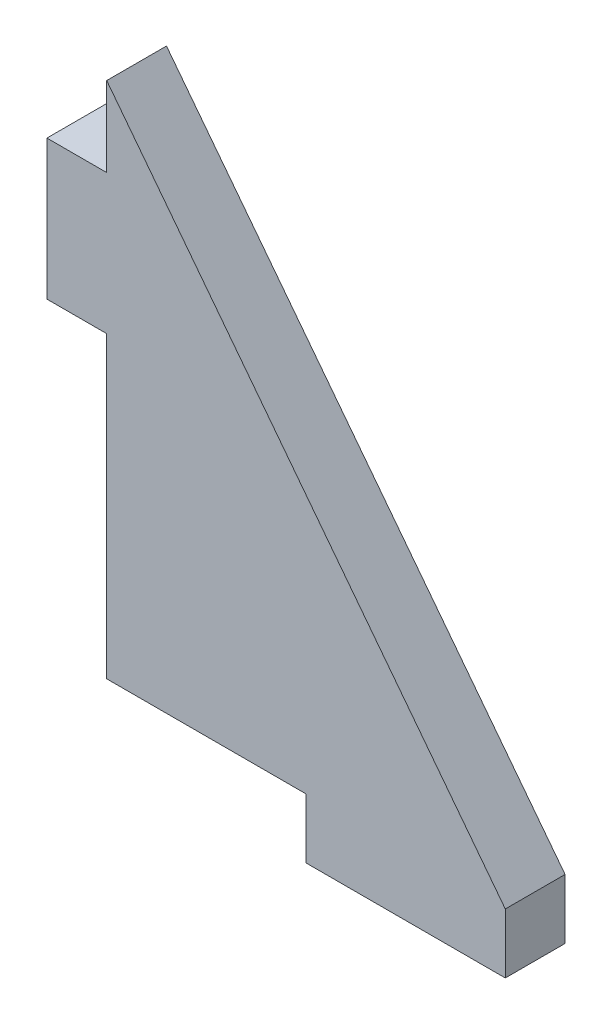
ISO-10303-21;
HEADER;
FILE_DESCRIPTION(('STEP AP214'),'2;1');
FILE_NAME('part.step','',(''),(''),'','','');
FILE_SCHEMA(('AUTOMOTIVE_DESIGN { 1 0 10303 214 1 1 1 1 }'));
ENDSEC;
DATA;
#1=APPLICATION_CONTEXT('core data for automotive mechanical design processes');
#2=APPLICATION_PROTOCOL_DEFINITION('international standard','automotive_design',2000,#1);
#3=PRODUCT_CONTEXT('',#1,'mechanical');
#4=PRODUCT('Part','Part','',(#3));
#5=PRODUCT_RELATED_PRODUCT_CATEGORY('part','',(#4));
#6=PRODUCT_DEFINITION_FORMATION('','',#4);
#7=PRODUCT_DEFINITION_CONTEXT('part definition',#1,'design');
#8=PRODUCT_DEFINITION('design','',#6,#7);
#9=PRODUCT_DEFINITION_SHAPE('','',#8);
#10=(LENGTH_UNIT() NAMED_UNIT(*) SI_UNIT(.MILLI.,.METRE.));
#11=(NAMED_UNIT(*) PLANE_ANGLE_UNIT() SI_UNIT($,.RADIAN.));
#12=(NAMED_UNIT(*) SI_UNIT($,.STERADIAN.) SOLID_ANGLE_UNIT());
#13=UNCERTAINTY_MEASURE_WITH_UNIT(LENGTH_MEASURE(1.E-05),#10,'distance_accuracy_value','');
#14=(GEOMETRIC_REPRESENTATION_CONTEXT(3) GLOBAL_UNCERTAINTY_ASSIGNED_CONTEXT((#13)) GLOBAL_UNIT_ASSIGNED_CONTEXT((#10,
#11,#12)) REPRESENTATION_CONTEXT('',''));
#15=CARTESIAN_POINT('',(0.,0.,0.));
#16=DIRECTION('',(0.,0.,1.));
#17=DIRECTION('',(1.,0.,0.));
#18=AXIS2_PLACEMENT_3D('',#15,#16,#17);
#19=CARTESIAN_POINT('',(0.,0.,3.));
#20=DIRECTION('',(0.,-1.,0.));
#21=DIRECTION('',(0.,0.,-1.));
#22=AXIS2_PLACEMENT_3D('',#19,#20,#21);
#23=PLANE('',#22);
#24=DIRECTION('',(-1.,0.,0.));
#25=VECTOR('',#24,1.);
#26=CARTESIAN_POINT('',(0.,0.,0.));
#27=LINE('',#26,#25);
#28=CARTESIAN_POINT('',(10.,0.,0.));
#29=VERTEX_POINT('',#28);
#30=CARTESIAN_POINT('',(0.,0.,0.));
#31=VERTEX_POINT('',#30);
#32=EDGE_CURVE('E144',#29,#31,#27,.T.);
#33=ORIENTED_EDGE('',*,*,#32,.F.);
#34=DIRECTION('',(0.,0.,-1.));
#35=VECTOR('',#34,1.);
#36=CARTESIAN_POINT('',(10.,0.,3.));
#37=LINE('',#36,#35);
#38=CARTESIAN_POINT('',(10.,0.,3.));
#39=VERTEX_POINT('',#38);
#40=EDGE_CURVE('E11',#39,#29,#37,.T.);
#41=ORIENTED_EDGE('',*,*,#40,.F.);
#42=DIRECTION('',(-1.,0.,0.));
#43=VECTOR('',#42,1.);
#44=CARTESIAN_POINT('',(0.,0.,3.));
#45=LINE('',#44,#43);
#46=CARTESIAN_POINT('',(0.,0.,3.));
#47=VERTEX_POINT('',#46);
#48=EDGE_CURVE('E202',#39,#47,#45,.T.);
#49=ORIENTED_EDGE('',*,*,#48,.T.);
#50=DIRECTION('',(0.,0.,-1.));
#51=VECTOR('',#50,1.);
#52=CARTESIAN_POINT('',(0.,0.,3.));
#53=LINE('',#52,#51);
#54=EDGE_CURVE('E52',#47,#31,#53,.T.);
#55=ORIENTED_EDGE('',*,*,#54,.T.);
#56=EDGE_LOOP('',(#33,#41,#49,#55));
#57=FACE_BOUND('',#56,.T.);
#58=ADVANCED_FACE('F36',(#57),#23,.T.);
#59=CARTESIAN_POINT('',(10.,0.,3.));
#60=DIRECTION('',(1.,0.,0.));
#61=DIRECTION('',(0.,0.,-1.));
#62=AXIS2_PLACEMENT_3D('',#59,#60,#61);
#63=PLANE('',#62);
#64=DIRECTION('',(0.,-1.,0.));
#65=VECTOR('',#64,1.);
#66=CARTESIAN_POINT('',(10.,0.,0.));
#67=LINE('',#66,#65);
#68=CARTESIAN_POINT('',(10.,-3.,0.));
#69=VERTEX_POINT('',#68);
#70=EDGE_CURVE('E146',#29,#69,#67,.T.);
#71=ORIENTED_EDGE('',*,*,#70,.T.);
#72=DIRECTION('',(0.,0.,-1.));
#73=VECTOR('',#72,1.);
#74=CARTESIAN_POINT('',(10.,-3.,3.));
#75=LINE('',#74,#73);
#76=CARTESIAN_POINT('',(10.,-3.,3.));
#77=VERTEX_POINT('',#76);
#78=EDGE_CURVE('E44',#77,#69,#75,.T.);
#79=ORIENTED_EDGE('',*,*,#78,.F.);
#80=DIRECTION('',(0.,-1.,0.));
#81=VECTOR('',#80,1.);
#82=CARTESIAN_POINT('',(10.,0.,3.));
#83=LINE('',#82,#81);
#84=EDGE_CURVE('E198',#39,#77,#83,.T.);
#85=ORIENTED_EDGE('',*,*,#84,.F.);
#86=ORIENTED_EDGE('',*,*,#40,.T.);
#87=EDGE_LOOP('',(#71,#79,#85,#86));
#88=FACE_BOUND('',#87,.T.);
#89=ADVANCED_FACE('F186',(#88),#63,.F.);
#90=CARTESIAN_POINT('',(0.,-3.,3.));
#91=DIRECTION('',(0.,-1.,0.));
#92=DIRECTION('',(1.,0.,0.));
#93=AXIS2_PLACEMENT_3D('',#90,#91,#92);
#94=PLANE('',#93);
#95=DIRECTION('',(-1.,0.,0.));
#96=VECTOR('',#95,1.);
#97=CARTESIAN_POINT('',(0.,-3.,0.));
#98=LINE('',#97,#96);
#99=CARTESIAN_POINT('',(20.,-3.,0.));
#100=VERTEX_POINT('',#99);
#101=EDGE_CURVE('E149',#100,#69,#98,.T.);
#102=ORIENTED_EDGE('',*,*,#101,.F.);
#103=DIRECTION('',(0.,0.,-1.));
#104=VECTOR('',#103,1.);
#105=CARTESIAN_POINT('',(20.,-3.,3.));
#106=LINE('',#105,#104);
#107=CARTESIAN_POINT('',(20.,-3.,3.));
#108=VERTEX_POINT('',#107);
#109=EDGE_CURVE('E176',#108,#100,#106,.T.);
#110=ORIENTED_EDGE('',*,*,#109,.F.);
#111=DIRECTION('',(-1.,0.,0.));
#112=VECTOR('',#111,1.);
#113=CARTESIAN_POINT('',(0.,-3.,3.));
#114=LINE('',#113,#112);
#115=EDGE_CURVE('E183',#108,#77,#114,.T.);
#116=ORIENTED_EDGE('',*,*,#115,.T.);
#117=ORIENTED_EDGE('',*,*,#78,.T.);
#118=EDGE_LOOP('',(#102,#110,#116,#117));
#119=FACE_BOUND('',#118,.T.);
#120=ADVANCED_FACE('F181',(#119),#94,.T.);
#121=CARTESIAN_POINT('',(20.,0.,3.));
#122=DIRECTION('',(1.,0.,0.));
#123=DIRECTION('',(0.,0.,-1.));
#124=AXIS2_PLACEMENT_3D('',#121,#122,#123);
#125=PLANE('',#124);
#126=DIRECTION('',(0.,-1.,0.));
#127=VECTOR('',#126,1.);
#128=CARTESIAN_POINT('',(20.,0.,0.));
#129=LINE('',#128,#127);
#130=CARTESIAN_POINT('',(20.,0.,0.));
#131=VERTEX_POINT('',#130);
#132=EDGE_CURVE('E152',#131,#100,#129,.T.);
#133=ORIENTED_EDGE('',*,*,#132,.F.);
#134=DIRECTION('',(0.,0.,-1.));
#135=VECTOR('',#134,1.);
#136=CARTESIAN_POINT('',(20.,0.,3.));
#137=LINE('',#136,#135);
#138=CARTESIAN_POINT('',(20.,0.,3.));
#139=VERTEX_POINT('',#138);
#140=EDGE_CURVE('E174',#139,#131,#137,.T.);
#141=ORIENTED_EDGE('',*,*,#140,.F.);
#142=DIRECTION('',(0.,-1.,0.));
#143=VECTOR('',#142,1.);
#144=CARTESIAN_POINT('',(20.,0.,3.));
#145=LINE('',#144,#143);
#146=EDGE_CURVE('E195',#139,#108,#145,.T.);
#147=ORIENTED_EDGE('',*,*,#146,.T.);
#148=ORIENTED_EDGE('',*,*,#109,.T.);
#149=EDGE_LOOP('',(#133,#141,#147,#148));
#150=FACE_BOUND('',#149,.T.);
#151=ADVANCED_FACE('F192',(#150),#125,.T.);
#152=CARTESIAN_POINT('',(12.5650557620818,9.66542750929368,3.));
#153=DIRECTION('',(0.7926239891046,0.609710760849692,0.));
#154=DIRECTION('',(-0.609710760849692,0.7926239891046,0.));
#155=AXIS2_PLACEMENT_3D('',#152,#153,#154);
#156=PLANE('',#155);
#157=DIRECTION('',(0.609710760849692,-0.7926239891046,0.));
#158=VECTOR('',#157,1.);
#159=CARTESIAN_POINT('',(12.5650557620818,9.66542750929368,0.));
#160=LINE('',#159,#158);
#161=CARTESIAN_POINT('',(0.,26.,0.));
#162=VERTEX_POINT('',#161);
#163=EDGE_CURVE('E155',#162,#131,#160,.T.);
#164=ORIENTED_EDGE('',*,*,#163,.F.);
#165=DIRECTION('',(0.,0.,-1.));
#166=VECTOR('',#165,1.);
#167=CARTESIAN_POINT('',(0.,26.,3.));
#168=LINE('',#167,#166);
#169=CARTESIAN_POINT('',(0.,26.,3.));
#170=VERTEX_POINT('',#169);
#171=EDGE_CURVE('E172',#170,#162,#168,.T.);
#172=ORIENTED_EDGE('',*,*,#171,.F.);
#173=DIRECTION('',(0.609710760849692,-0.7926239891046,0.));
#174=VECTOR('',#173,1.);
#175=CARTESIAN_POINT('',(12.5650557620818,9.66542750929368,3.));
#176=LINE('',#175,#174);
#177=EDGE_CURVE('E200',#170,#139,#176,.T.);
#178=ORIENTED_EDGE('',*,*,#177,.T.);
#179=ORIENTED_EDGE('',*,*,#140,.T.);
#180=EDGE_LOOP('',(#164,#172,#178,#179));
#181=FACE_BOUND('',#180,.T.);
#182=ADVANCED_FACE('F211',(#181),#156,.T.);
#183=CARTESIAN_POINT('',(0.,0.,3.));
#184=DIRECTION('',(-1.,0.,0.));
#185=DIRECTION('',(0.,0.,1.));
#186=AXIS2_PLACEMENT_3D('',#183,#184,#185);
#187=PLANE('',#186);
#188=DIRECTION('',(0.,1.,0.));
#189=VECTOR('',#188,1.);
#190=CARTESIAN_POINT('',(0.,0.,0.));
#191=LINE('',#190,#189);
#192=CARTESIAN_POINT('',(0.,22.,0.));
#193=VERTEX_POINT('',#192);
#194=EDGE_CURVE('E158',#193,#162,#191,.T.);
#195=ORIENTED_EDGE('',*,*,#194,.F.);
#196=DIRECTION('',(0.,0.,-1.));
#197=VECTOR('',#196,1.);
#198=CARTESIAN_POINT('',(0.,22.,3.));
#199=LINE('',#198,#197);
#200=CARTESIAN_POINT('',(0.,22.,3.));
#201=VERTEX_POINT('',#200);
#202=EDGE_CURVE('E170',#201,#193,#199,.T.);
#203=ORIENTED_EDGE('',*,*,#202,.F.);
#204=DIRECTION('',(0.,1.,0.));
#205=VECTOR('',#204,1.);
#206=CARTESIAN_POINT('',(0.,0.,3.));
#207=LINE('',#206,#205);
#208=EDGE_CURVE('E141',#201,#170,#207,.T.);
#209=ORIENTED_EDGE('',*,*,#208,.T.);
#210=ORIENTED_EDGE('',*,*,#171,.T.);
#211=EDGE_LOOP('',(#195,#203,#209,#210));
#212=FACE_BOUND('',#211,.T.);
#213=ADVANCED_FACE('F209',(#212),#187,.T.);
#214=CARTESIAN_POINT('',(0.,22.,3.));
#215=DIRECTION('',(0.,-1.,0.));
#216=DIRECTION('',(0.,0.,-1.));
#217=AXIS2_PLACEMENT_3D('',#214,#215,#216);
#218=PLANE('',#217);
#219=DIRECTION('',(-1.,0.,0.));
#220=VECTOR('',#219,1.);
#221=CARTESIAN_POINT('',(0.,22.,0.));
#222=LINE('',#221,#220);
#223=CARTESIAN_POINT('',(-3.,22.,0.));
#224=VERTEX_POINT('',#223);
#225=EDGE_CURVE('E161',#193,#224,#222,.T.);
#226=ORIENTED_EDGE('',*,*,#225,.T.);
#227=DIRECTION('',(0.,0.,-1.));
#228=VECTOR('',#227,1.);
#229=CARTESIAN_POINT('',(-3.,22.,3.));
#230=LINE('',#229,#228);
#231=CARTESIAN_POINT('',(-3.,22.,3.));
#232=VERTEX_POINT('',#231);
#233=EDGE_CURVE('E135',#232,#224,#230,.T.);
#234=ORIENTED_EDGE('',*,*,#233,.F.);
#235=DIRECTION('',(-1.,0.,0.));
#236=VECTOR('',#235,1.);
#237=CARTESIAN_POINT('',(0.,22.,3.));
#238=LINE('',#237,#236);
#239=EDGE_CURVE('E123',#201,#232,#238,.T.);
#240=ORIENTED_EDGE('',*,*,#239,.F.);
#241=ORIENTED_EDGE('',*,*,#202,.T.);
#242=EDGE_LOOP('',(#226,#234,#240,#241));
#243=FACE_BOUND('',#242,.T.);
#244=ADVANCED_FACE('F214',(#243),#218,.F.);
#245=CARTESIAN_POINT('',(-3.,0.,3.));
#246=DIRECTION('',(1.,0.,0.));
#247=DIRECTION('',(0.,1.,0.));
#248=AXIS2_PLACEMENT_3D('',#245,#246,#247);
#249=PLANE('',#248);
#250=DIRECTION('',(0.,-1.,0.));
#251=VECTOR('',#250,1.);
#252=CARTESIAN_POINT('',(-3.,0.,0.));
#253=LINE('',#252,#251);
#254=CARTESIAN_POINT('',(-3.,15.,0.));
#255=VERTEX_POINT('',#254);
#256=EDGE_CURVE('E132',#224,#255,#253,.T.);
#257=ORIENTED_EDGE('',*,*,#256,.T.);
#258=DIRECTION('',(0.,0.,-1.));
#259=VECTOR('',#258,1.);
#260=CARTESIAN_POINT('',(-3.,15.,3.));
#261=LINE('',#260,#259);
#262=CARTESIAN_POINT('',(-3.,15.,3.));
#263=VERTEX_POINT('',#262);
#264=EDGE_CURVE('E129',#263,#255,#261,.T.);
#265=ORIENTED_EDGE('',*,*,#264,.F.);
#266=DIRECTION('',(0.,-1.,0.));
#267=VECTOR('',#266,1.);
#268=CARTESIAN_POINT('',(-3.,0.,3.));
#269=LINE('',#268,#267);
#270=EDGE_CURVE('E114',#232,#263,#269,.T.);
#271=ORIENTED_EDGE('',*,*,#270,.F.);
#272=ORIENTED_EDGE('',*,*,#233,.T.);
#273=EDGE_LOOP('',(#257,#265,#271,#272));
#274=FACE_BOUND('',#273,.T.);
#275=ADVANCED_FACE('F130',(#274),#249,.F.);
#276=CARTESIAN_POINT('',(0.,15.,3.));
#277=DIRECTION('',(0.,-1.,0.));
#278=DIRECTION('',(0.,0.,-1.));
#279=AXIS2_PLACEMENT_3D('',#276,#277,#278);
#280=PLANE('',#279);
#281=DIRECTION('',(-1.,0.,0.));
#282=VECTOR('',#281,1.);
#283=CARTESIAN_POINT('',(0.,15.,0.));
#284=LINE('',#283,#282);
#285=CARTESIAN_POINT('',(0.,15.,0.));
#286=VERTEX_POINT('',#285);
#287=EDGE_CURVE('E165',#286,#255,#284,.T.);
#288=ORIENTED_EDGE('',*,*,#287,.F.);
#289=DIRECTION('',(0.,0.,-1.));
#290=VECTOR('',#289,1.);
#291=CARTESIAN_POINT('',(0.,15.,3.));
#292=LINE('',#291,#290);
#293=CARTESIAN_POINT('',(0.,15.,3.));
#294=VERTEX_POINT('',#293);
#295=EDGE_CURVE('E83',#294,#286,#292,.T.);
#296=ORIENTED_EDGE('',*,*,#295,.F.);
#297=DIRECTION('',(-1.,0.,0.));
#298=VECTOR('',#297,1.);
#299=CARTESIAN_POINT('',(0.,15.,3.));
#300=LINE('',#299,#298);
#301=EDGE_CURVE('E120',#294,#263,#300,.T.);
#302=ORIENTED_EDGE('',*,*,#301,.T.);
#303=ORIENTED_EDGE('',*,*,#264,.T.);
#304=EDGE_LOOP('',(#288,#296,#302,#303));
#305=FACE_BOUND('',#304,.T.);
#306=ADVANCED_FACE('F137',(#305),#280,.T.);
#307=EDGE_CURVE('E162',#31,#286,#191,.T.);
#308=ORIENTED_EDGE('',*,*,#307,.F.);
#309=ORIENTED_EDGE('',*,*,#54,.F.);
#310=EDGE_CURVE('E138',#47,#294,#207,.T.);
#311=ORIENTED_EDGE('',*,*,#310,.T.);
#312=ORIENTED_EDGE('',*,*,#295,.T.);
#313=EDGE_LOOP('',(#308,#309,#311,#312));
#314=FACE_BOUND('',#313,.T.);
#315=ADVANCED_FACE('F223',(#314),#187,.T.);
#316=CARTESIAN_POINT('',(0.,0.,3.));
#317=DIRECTION('',(0.,0.,1.));
#318=DIRECTION('',(1.,0.,0.));
#319=AXIS2_PLACEMENT_3D('',#316,#317,#318);
#320=PLANE('',#319);
#321=ORIENTED_EDGE('',*,*,#48,.F.);
#322=ORIENTED_EDGE('',*,*,#84,.T.);
#323=ORIENTED_EDGE('',*,*,#115,.F.);
#324=ORIENTED_EDGE('',*,*,#146,.F.);
#325=ORIENTED_EDGE('',*,*,#177,.F.);
#326=ORIENTED_EDGE('',*,*,#208,.F.);
#327=ORIENTED_EDGE('',*,*,#239,.T.);
#328=ORIENTED_EDGE('',*,*,#270,.T.);
#329=ORIENTED_EDGE('',*,*,#301,.F.);
#330=ORIENTED_EDGE('',*,*,#310,.F.);
#331=EDGE_LOOP('',(#321,#322,#323,#324,#325,#326,#327,#328,#329,#330));
#332=FACE_BOUND('',#331,.T.);
#333=ADVANCED_FACE('F117',(#332),#320,.T.);
#334=CARTESIAN_POINT('',(0.,0.,0.));
#335=DIRECTION('',(0.,0.,1.));
#336=DIRECTION('',(1.,0.,0.));
#337=AXIS2_PLACEMENT_3D('',#334,#335,#336);
#338=PLANE('',#337);
#339=ORIENTED_EDGE('',*,*,#32,.T.);
#340=ORIENTED_EDGE('',*,*,#307,.T.);
#341=ORIENTED_EDGE('',*,*,#287,.T.);
#342=ORIENTED_EDGE('',*,*,#256,.F.);
#343=ORIENTED_EDGE('',*,*,#225,.F.);
#344=ORIENTED_EDGE('',*,*,#194,.T.);
#345=ORIENTED_EDGE('',*,*,#163,.T.);
#346=ORIENTED_EDGE('',*,*,#132,.T.);
#347=ORIENTED_EDGE('',*,*,#101,.T.);
#348=ORIENTED_EDGE('',*,*,#70,.F.);
#349=EDGE_LOOP('',(#339,#340,#341,#342,#343,#344,#345,#346,#347,#348));
#350=FACE_BOUND('',#349,.T.);
#351=ADVANCED_FACE('F188',(#350),#338,.F.);
#352=CLOSED_SHELL('',(#58,#89,#120,#151,#182,#213,#244,#275,#306,#315,#333,#351));
#353=MANIFOLD_SOLID_BREP('B2',#352);
#354=ADVANCED_BREP_SHAPE_REPRESENTATION('',(#18,#353),#14);
#355=SHAPE_DEFINITION_REPRESENTATION(#9,#354);
ENDSEC;
END-ISO-10303-21;
